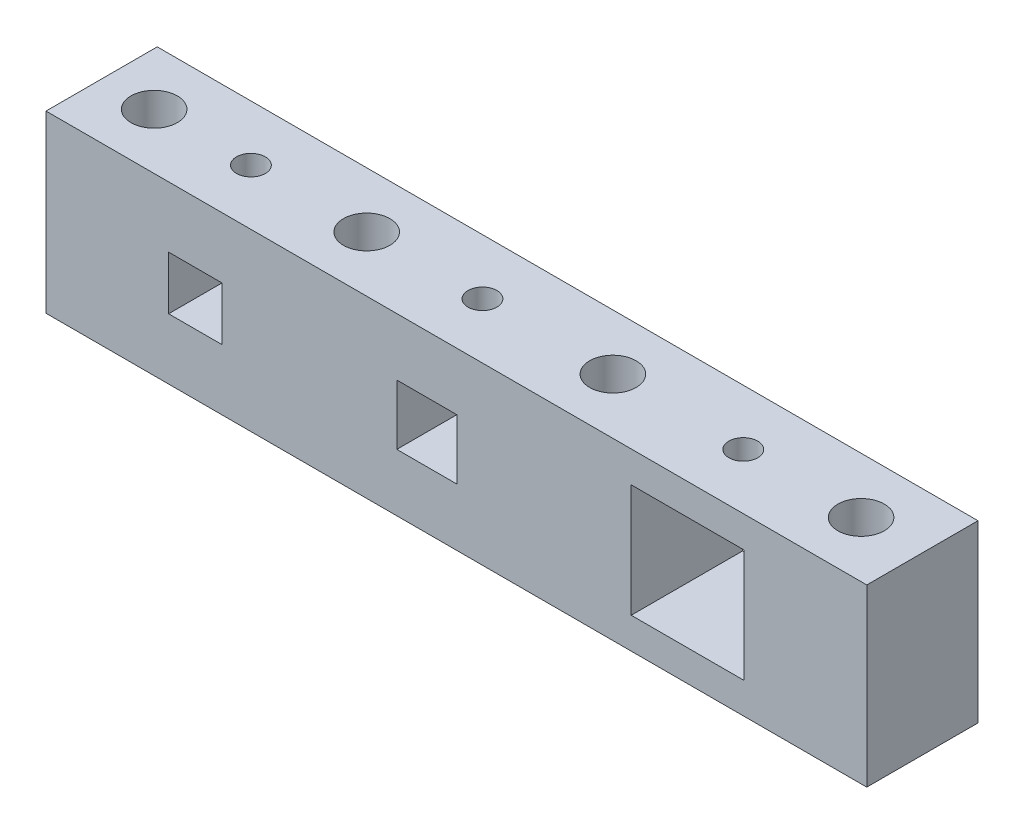
ISO-10303-21;
HEADER;
FILE_DESCRIPTION(('STEP AP214'),'2;1');
FILE_NAME('part.step','',(''),(''),'','','');
FILE_SCHEMA(('AUTOMOTIVE_DESIGN { 1 0 10303 214 1 1 1 1 }'));
ENDSEC;
DATA;
#1=APPLICATION_CONTEXT('core data for automotive mechanical design processes');
#2=APPLICATION_PROTOCOL_DEFINITION('international standard','automotive_design',2000,#1);
#3=PRODUCT_CONTEXT('',#1,'mechanical');
#4=PRODUCT('Part','Part','',(#3));
#5=PRODUCT_RELATED_PRODUCT_CATEGORY('part','',(#4));
#6=PRODUCT_DEFINITION_FORMATION('','',#4);
#7=PRODUCT_DEFINITION_CONTEXT('part definition',#1,'design');
#8=PRODUCT_DEFINITION('design','',#6,#7);
#9=PRODUCT_DEFINITION_SHAPE('','',#8);
#10=(LENGTH_UNIT() NAMED_UNIT(*) SI_UNIT(.MILLI.,.METRE.));
#11=(NAMED_UNIT(*) PLANE_ANGLE_UNIT() SI_UNIT($,.RADIAN.));
#12=(NAMED_UNIT(*) SI_UNIT($,.STERADIAN.) SOLID_ANGLE_UNIT());
#13=UNCERTAINTY_MEASURE_WITH_UNIT(LENGTH_MEASURE(1.E-05),#10,'distance_accuracy_value','');
#14=(GEOMETRIC_REPRESENTATION_CONTEXT(3) GLOBAL_UNCERTAINTY_ASSIGNED_CONTEXT((#13)) GLOBAL_UNIT_ASSIGNED_CONTEXT((#10,
#11,#12)) REPRESENTATION_CONTEXT('',''));
#15=CARTESIAN_POINT('',(0.,0.,0.));
#16=DIRECTION('',(0.,0.,1.));
#17=DIRECTION('',(1.,0.,0.));
#18=AXIS2_PLACEMENT_3D('',#15,#16,#17);
#19=CARTESIAN_POINT('',(-43.489,10.,12.7));
#20=DIRECTION('',(0.,-1.,0.));
#21=DIRECTION('',(0.,0.,-1.));
#22=AXIS2_PLACEMENT_3D('',#19,#20,#21);
#23=PLANE('',#22);
#24=CARTESIAN_POINT('',(-37.489,10.,6.35));
#25=DIRECTION('',(0.,1.,0.));
#26=DIRECTION('',(0.,0.,1.));
#27=AXIS2_PLACEMENT_3D('',#24,#25,#26);
#28=CIRCLE('',#27,2.65);
#29=CARTESIAN_POINT('',(-37.489,10.,9.));
#30=VERTEX_POINT('',#29);
#31=EDGE_CURVE('E445',#30,#30,#28,.T.);
#32=ORIENTED_EDGE('',*,*,#31,.F.);
#33=EDGE_LOOP('',(#32));
#34=FACE_BOUND('',#33,.T.);
#35=CARTESIAN_POINT('',(14.8945,10.,6.35));
#36=DIRECTION('',(0.,1.,0.));
#37=DIRECTION('',(0.,0.,1.));
#38=AXIS2_PLACEMENT_3D('',#35,#36,#37);
#39=CIRCLE('',#38,2.65);
#40=CARTESIAN_POINT('',(14.8945,10.,9.));
#41=VERTEX_POINT('',#40);
#42=EDGE_CURVE('E459',#41,#41,#39,.T.);
#43=ORIENTED_EDGE('',*,*,#42,.F.);
#44=EDGE_LOOP('',(#43));
#45=FACE_BOUND('',#44,.T.);
#46=CARTESIAN_POINT('',(43.239,10.,6.35));
#47=DIRECTION('',(0.,1.,0.));
#48=DIRECTION('',(0.,0.,1.));
#49=AXIS2_PLACEMENT_3D('',#46,#47,#48);
#50=CIRCLE('',#49,2.65);
#51=CARTESIAN_POINT('',(43.239,10.,9.));
#52=VERTEX_POINT('',#51);
#53=EDGE_CURVE('E467',#52,#52,#50,.T.);
#54=ORIENTED_EDGE('',*,*,#53,.F.);
#55=EDGE_LOOP('',(#54));
#56=FACE_BOUND('',#55,.T.);
#57=CARTESIAN_POINT('',(-26.439,10.,6.35));
#58=DIRECTION('',(0.,1.,0.));
#59=DIRECTION('',(0.,0.,1.));
#60=AXIS2_PLACEMENT_3D('',#57,#58,#59);
#61=CIRCLE('',#60,1.65);
#62=CARTESIAN_POINT('',(-26.439,10.,8.));
#63=VERTEX_POINT('',#62);
#64=EDGE_CURVE('E475',#63,#63,#61,.T.);
#65=ORIENTED_EDGE('',*,*,#64,.F.);
#66=EDGE_LOOP('',(#65));
#67=FACE_BOUND('',#66,.T.);
#68=CARTESIAN_POINT('',(0.,10.,6.35));
#69=DIRECTION('',(0.,1.,0.));
#70=DIRECTION('',(0.,0.,1.));
#71=AXIS2_PLACEMENT_3D('',#68,#69,#70);
#72=CIRCLE('',#71,1.65);
#73=CARTESIAN_POINT('',(0.,10.,8.));
#74=VERTEX_POINT('',#73);
#75=EDGE_CURVE('E483',#74,#74,#72,.T.);
#76=ORIENTED_EDGE('',*,*,#75,.F.);
#77=EDGE_LOOP('',(#76));
#78=FACE_BOUND('',#77,.T.);
#79=CARTESIAN_POINT('',(29.789,10.,6.35));
#80=DIRECTION('',(0.,1.,0.));
#81=DIRECTION('',(0.,0.,1.));
#82=AXIS2_PLACEMENT_3D('',#79,#80,#81);
#83=CIRCLE('',#82,1.65);
#84=CARTESIAN_POINT('',(29.789,10.,8.));
#85=VERTEX_POINT('',#84);
#86=EDGE_CURVE('E491',#85,#85,#83,.T.);
#87=ORIENTED_EDGE('',*,*,#86,.F.);
#88=EDGE_LOOP('',(#87));
#89=FACE_BOUND('',#88,.T.);
#90=DIRECTION('',(-1.,0.,0.));
#91=VECTOR('',#90,1.);
#92=CARTESIAN_POINT('',(-43.489,10.,0.));
#93=LINE('',#92,#91);
#94=CARTESIAN_POINT('',(50.239,10.,0.));
#95=VERTEX_POINT('',#94);
#96=CARTESIAN_POINT('',(-43.489,10.,0.));
#97=VERTEX_POINT('',#96);
#98=EDGE_CURVE('E295',#95,#97,#93,.T.);
#99=ORIENTED_EDGE('',*,*,#98,.T.);
#100=DIRECTION('',(0.,0.,-1.));
#101=VECTOR('',#100,1.);
#102=CARTESIAN_POINT('',(-43.489,10.,12.7));
#103=LINE('',#102,#101);
#104=CARTESIAN_POINT('',(-43.489,10.,12.7));
#105=VERTEX_POINT('',#104);
#106=EDGE_CURVE('E304',#105,#97,#103,.T.);
#107=ORIENTED_EDGE('',*,*,#106,.F.);
#108=DIRECTION('',(-1.,0.,0.));
#109=VECTOR('',#108,1.);
#110=CARTESIAN_POINT('',(-43.489,10.,12.7));
#111=LINE('',#110,#109);
#112=CARTESIAN_POINT('',(50.239,10.,12.7));
#113=VERTEX_POINT('',#112);
#114=EDGE_CURVE('E301',#113,#105,#111,.T.);
#115=ORIENTED_EDGE('',*,*,#114,.F.);
#116=DIRECTION('',(0.,0.,-1.));
#117=VECTOR('',#116,1.);
#118=CARTESIAN_POINT('',(50.239,10.,12.7));
#119=LINE('',#118,#117);
#120=EDGE_CURVE('E319',#113,#95,#119,.T.);
#121=ORIENTED_EDGE('',*,*,#120,.T.);
#122=EDGE_LOOP('',(#99,#107,#115,#121));
#123=FACE_BOUND('',#122,.T.);
#124=CARTESIAN_POINT('',(-13.2195,10.,6.35));
#125=DIRECTION('',(0.,1.,0.));
#126=DIRECTION('',(0.,0.,1.));
#127=AXIS2_PLACEMENT_3D('',#124,#125,#126);
#128=CIRCLE('',#127,2.65);
#129=CARTESIAN_POINT('',(-13.2195,10.,9.));
#130=VERTEX_POINT('',#129);
#131=EDGE_CURVE('E449',#130,#130,#128,.T.);
#132=ORIENTED_EDGE('',*,*,#131,.F.);
#133=EDGE_LOOP('',(#132));
#134=FACE_BOUND('',#133,.T.);
#135=ADVANCED_FACE('F39',(#34,#45,#56,#67,#78,#89,#123,#134),#23,.F.);
#136=CARTESIAN_POINT('',(0.,0.,12.7));
#137=DIRECTION('',(0.,0.,1.));
#138=DIRECTION('',(1.,0.,0.));
#139=AXIS2_PLACEMENT_3D('',#136,#137,#138);
#140=PLANE('',#139);
#141=DIRECTION('',(0.,-1.,0.));
#142=VECTOR('',#141,1.);
#143=CARTESIAN_POINT('',(-43.489,10.,12.7));
#144=LINE('',#143,#142);
#145=CARTESIAN_POINT('',(-43.489,-10.,12.7));
#146=VERTEX_POINT('',#145);
#147=EDGE_CURVE('E290',#105,#146,#144,.T.);
#148=ORIENTED_EDGE('',*,*,#147,.T.);
#149=DIRECTION('',(1.,0.,0.));
#150=VECTOR('',#149,1.);
#151=CARTESIAN_POINT('',(-43.489,-10.,12.7));
#152=LINE('',#151,#150);
#153=CARTESIAN_POINT('',(50.239,-10.,12.7));
#154=VERTEX_POINT('',#153);
#155=EDGE_CURVE('E294',#146,#154,#152,.T.);
#156=ORIENTED_EDGE('',*,*,#155,.T.);
#157=DIRECTION('',(0.,1.,0.));
#158=VECTOR('',#157,1.);
#159=CARTESIAN_POINT('',(50.239,10.,12.7));
#160=LINE('',#159,#158);
#161=EDGE_CURVE('E298',#154,#113,#160,.T.);
#162=ORIENTED_EDGE('',*,*,#161,.T.);
#163=ORIENTED_EDGE('',*,*,#114,.T.);
#164=EDGE_LOOP('',(#148,#156,#162,#163));
#165=FACE_BOUND('',#164,.T.);
#166=DIRECTION('',(-1.,0.,0.));
#167=VECTOR('',#166,1.);
#168=CARTESIAN_POINT('',(-29.489,3.05,12.7));
#169=LINE('',#168,#167);
#170=CARTESIAN_POINT('',(-23.389,3.05,12.7));
#171=VERTEX_POINT('',#170);
#172=CARTESIAN_POINT('',(-29.489,3.05,12.7));
#173=VERTEX_POINT('',#172);
#174=EDGE_CURVE('E250',#171,#173,#169,.T.);
#175=ORIENTED_EDGE('',*,*,#174,.F.);
#176=DIRECTION('',(0.,1.,0.));
#177=VECTOR('',#176,1.);
#178=CARTESIAN_POINT('',(-23.389,-3.05,12.7));
#179=LINE('',#178,#177);
#180=CARTESIAN_POINT('',(-23.389,-3.05,12.7));
#181=VERTEX_POINT('',#180);
#182=EDGE_CURVE('E247',#181,#171,#179,.T.);
#183=ORIENTED_EDGE('',*,*,#182,.F.);
#184=DIRECTION('',(1.,0.,0.));
#185=VECTOR('',#184,1.);
#186=CARTESIAN_POINT('',(-29.489,-3.05,12.7));
#187=LINE('',#186,#185);
#188=CARTESIAN_POINT('',(-29.489,-3.05,12.7));
#189=VERTEX_POINT('',#188);
#190=EDGE_CURVE('E258',#189,#181,#187,.T.);
#191=ORIENTED_EDGE('',*,*,#190,.F.);
#192=DIRECTION('',(0.,-1.,0.));
#193=VECTOR('',#192,1.);
#194=CARTESIAN_POINT('',(-29.489,-3.05,12.7));
#195=LINE('',#194,#193);
#196=EDGE_CURVE('E254',#173,#189,#195,.T.);
#197=ORIENTED_EDGE('',*,*,#196,.F.);
#198=EDGE_LOOP('',(#175,#183,#191,#197));
#199=FACE_BOUND('',#198,.T.);
#200=DIRECTION('',(-1.,0.,0.));
#201=VECTOR('',#200,1.);
#202=CARTESIAN_POINT('',(-3.429,3.429,12.7));
#203=LINE('',#202,#201);
#204=CARTESIAN_POINT('',(3.429,3.429,12.7));
#205=VERTEX_POINT('',#204);
#206=CARTESIAN_POINT('',(-3.429,3.429,12.7));
#207=VERTEX_POINT('',#206);
#208=EDGE_CURVE('E207',#205,#207,#203,.T.);
#209=ORIENTED_EDGE('',*,*,#208,.F.);
#210=DIRECTION('',(0.,1.,0.));
#211=VECTOR('',#210,1.);
#212=CARTESIAN_POINT('',(3.429,-3.429,12.7));
#213=LINE('',#212,#211);
#214=CARTESIAN_POINT('',(3.429,-3.429,12.7));
#215=VERTEX_POINT('',#214);
#216=EDGE_CURVE('E204',#215,#205,#213,.T.);
#217=ORIENTED_EDGE('',*,*,#216,.F.);
#218=DIRECTION('',(1.,0.,0.));
#219=VECTOR('',#218,1.);
#220=CARTESIAN_POINT('',(-3.429,-3.429,12.7));
#221=LINE('',#220,#219);
#222=CARTESIAN_POINT('',(-3.429,-3.429,12.7));
#223=VERTEX_POINT('',#222);
#224=EDGE_CURVE('E215',#223,#215,#221,.T.);
#225=ORIENTED_EDGE('',*,*,#224,.F.);
#226=DIRECTION('',(0.,-1.,0.));
#227=VECTOR('',#226,1.);
#228=CARTESIAN_POINT('',(-3.429,-3.429,12.7));
#229=LINE('',#228,#227);
#230=EDGE_CURVE('E211',#207,#223,#229,.T.);
#231=ORIENTED_EDGE('',*,*,#230,.F.);
#232=EDGE_LOOP('',(#209,#217,#225,#231));
#233=FACE_BOUND('',#232,.T.);
#234=DIRECTION('',(-1.,0.,0.));
#235=VECTOR('',#234,1.);
#236=CARTESIAN_POINT('',(23.339,6.45,12.7));
#237=LINE('',#236,#235);
#238=CARTESIAN_POINT('',(36.239,6.45,12.7));
#239=VERTEX_POINT('',#238);
#240=CARTESIAN_POINT('',(23.339,6.45,12.7));
#241=VERTEX_POINT('',#240);
#242=EDGE_CURVE('E162',#239,#241,#237,.T.);
#243=ORIENTED_EDGE('',*,*,#242,.F.);
#244=DIRECTION('',(0.,1.,0.));
#245=VECTOR('',#244,1.);
#246=CARTESIAN_POINT('',(36.239,-6.45,12.7));
#247=LINE('',#246,#245);
#248=CARTESIAN_POINT('',(36.239,-6.45,12.7));
#249=VERTEX_POINT('',#248);
#250=EDGE_CURVE('E153',#249,#239,#247,.T.);
#251=ORIENTED_EDGE('',*,*,#250,.F.);
#252=DIRECTION('',(1.,0.,0.));
#253=VECTOR('',#252,1.);
#254=CARTESIAN_POINT('',(23.339,-6.45,12.7));
#255=LINE('',#254,#253);
#256=CARTESIAN_POINT('',(23.339,-6.45,12.7));
#257=VERTEX_POINT('',#256);
#258=EDGE_CURVE('E180',#257,#249,#255,.T.);
#259=ORIENTED_EDGE('',*,*,#258,.F.);
#260=DIRECTION('',(0.,-1.,0.));
#261=VECTOR('',#260,1.);
#262=CARTESIAN_POINT('',(23.339,-6.45,12.7));
#263=LINE('',#262,#261);
#264=EDGE_CURVE('E176',#241,#257,#263,.T.);
#265=ORIENTED_EDGE('',*,*,#264,.F.);
#266=EDGE_LOOP('',(#243,#251,#259,#265));
#267=FACE_BOUND('',#266,.T.);
#268=ADVANCED_FACE('F175',(#165,#199,#233,#267),#140,.T.);
#269=CARTESIAN_POINT('',(0.,0.,0.));
#270=DIRECTION('',(0.,0.,1.));
#271=DIRECTION('',(1.,0.,0.));
#272=AXIS2_PLACEMENT_3D('',#269,#270,#271);
#273=PLANE('',#272);
#274=DIRECTION('',(0.,1.,0.));
#275=VECTOR('',#274,1.);
#276=CARTESIAN_POINT('',(3.429,-3.429,0.));
#277=LINE('',#276,#275);
#278=CARTESIAN_POINT('',(3.429,-3.429,0.));
#279=VERTEX_POINT('',#278);
#280=CARTESIAN_POINT('',(3.429,3.429,0.));
#281=VERTEX_POINT('',#280);
#282=EDGE_CURVE('E171',#279,#281,#277,.T.);
#283=ORIENTED_EDGE('',*,*,#282,.T.);
#284=DIRECTION('',(-1.,0.,0.));
#285=VECTOR('',#284,1.);
#286=CARTESIAN_POINT('',(-3.429,3.429,0.));
#287=LINE('',#286,#285);
#288=CARTESIAN_POINT('',(-3.429,3.429,0.));
#289=VERTEX_POINT('',#288);
#290=EDGE_CURVE('E222',#281,#289,#287,.T.);
#291=ORIENTED_EDGE('',*,*,#290,.T.);
#292=DIRECTION('',(0.,-1.,0.));
#293=VECTOR('',#292,1.);
#294=CARTESIAN_POINT('',(-3.429,-3.429,0.));
#295=LINE('',#294,#293);
#296=CARTESIAN_POINT('',(-3.429,-3.429,0.));
#297=VERTEX_POINT('',#296);
#298=EDGE_CURVE('E226',#289,#297,#295,.T.);
#299=ORIENTED_EDGE('',*,*,#298,.T.);
#300=DIRECTION('',(1.,0.,0.));
#301=VECTOR('',#300,1.);
#302=CARTESIAN_POINT('',(-3.429,-3.429,0.));
#303=LINE('',#302,#301);
#304=EDGE_CURVE('E208',#297,#279,#303,.T.);
#305=ORIENTED_EDGE('',*,*,#304,.T.);
#306=EDGE_LOOP('',(#283,#291,#299,#305));
#307=FACE_BOUND('',#306,.T.);
#308=DIRECTION('',(0.,-1.,0.));
#309=VECTOR('',#308,1.);
#310=CARTESIAN_POINT('',(-43.489,10.,0.));
#311=LINE('',#310,#309);
#312=CARTESIAN_POINT('',(-43.489,-10.,0.));
#313=VERTEX_POINT('',#312);
#314=EDGE_CURVE('E289',#97,#313,#311,.T.);
#315=ORIENTED_EDGE('',*,*,#314,.F.);
#316=ORIENTED_EDGE('',*,*,#98,.F.);
#317=DIRECTION('',(0.,1.,0.));
#318=VECTOR('',#317,1.);
#319=CARTESIAN_POINT('',(50.239,10.,0.));
#320=LINE('',#319,#318);
#321=CARTESIAN_POINT('',(50.239,-10.,0.));
#322=VERTEX_POINT('',#321);
#323=EDGE_CURVE('E311',#322,#95,#320,.T.);
#324=ORIENTED_EDGE('',*,*,#323,.F.);
#325=DIRECTION('',(1.,0.,0.));
#326=VECTOR('',#325,1.);
#327=CARTESIAN_POINT('',(-43.489,-10.,0.));
#328=LINE('',#327,#326);
#329=EDGE_CURVE('E308',#313,#322,#328,.T.);
#330=ORIENTED_EDGE('',*,*,#329,.F.);
#331=EDGE_LOOP('',(#315,#316,#324,#330));
#332=FACE_BOUND('',#331,.T.);
#333=DIRECTION('',(0.,1.,0.));
#334=VECTOR('',#333,1.);
#335=CARTESIAN_POINT('',(-23.389,-3.05,0.));
#336=LINE('',#335,#334);
#337=CARTESIAN_POINT('',(-23.389,-3.05,0.));
#338=VERTEX_POINT('',#337);
#339=CARTESIAN_POINT('',(-23.389,3.05,0.));
#340=VERTEX_POINT('',#339);
#341=EDGE_CURVE('E246',#338,#340,#336,.T.);
#342=ORIENTED_EDGE('',*,*,#341,.T.);
#343=DIRECTION('',(-1.,0.,0.));
#344=VECTOR('',#343,1.);
#345=CARTESIAN_POINT('',(-29.489,3.05,0.));
#346=LINE('',#345,#344);
#347=CARTESIAN_POINT('',(-29.489,3.05,0.));
#348=VERTEX_POINT('',#347);
#349=EDGE_CURVE('E265',#340,#348,#346,.T.);
#350=ORIENTED_EDGE('',*,*,#349,.T.);
#351=DIRECTION('',(0.,-1.,0.));
#352=VECTOR('',#351,1.);
#353=CARTESIAN_POINT('',(-29.489,-3.05,0.));
#354=LINE('',#353,#352);
#355=CARTESIAN_POINT('',(-29.489,-3.05,0.));
#356=VERTEX_POINT('',#355);
#357=EDGE_CURVE('E269',#348,#356,#354,.T.);
#358=ORIENTED_EDGE('',*,*,#357,.T.);
#359=DIRECTION('',(1.,0.,0.));
#360=VECTOR('',#359,1.);
#361=CARTESIAN_POINT('',(-29.489,-3.05,0.));
#362=LINE('',#361,#360);
#363=EDGE_CURVE('E251',#356,#338,#362,.T.);
#364=ORIENTED_EDGE('',*,*,#363,.T.);
#365=EDGE_LOOP('',(#342,#350,#358,#364));
#366=FACE_BOUND('',#365,.T.);
#367=DIRECTION('',(0.,1.,0.));
#368=VECTOR('',#367,1.);
#369=CARTESIAN_POINT('',(36.239,-6.45,0.));
#370=LINE('',#369,#368);
#371=CARTESIAN_POINT('',(36.239,-6.45,0.));
#372=VERTEX_POINT('',#371);
#373=CARTESIAN_POINT('',(36.239,6.45,0.));
#374=VERTEX_POINT('',#373);
#375=EDGE_CURVE('E63',#372,#374,#370,.T.);
#376=ORIENTED_EDGE('',*,*,#375,.T.);
#377=DIRECTION('',(-1.,0.,0.));
#378=VECTOR('',#377,1.);
#379=CARTESIAN_POINT('',(23.339,6.45,0.));
#380=LINE('',#379,#378);
#381=CARTESIAN_POINT('',(23.339,6.45,0.));
#382=VERTEX_POINT('',#381);
#383=EDGE_CURVE('E169',#374,#382,#380,.T.);
#384=ORIENTED_EDGE('',*,*,#383,.T.);
#385=DIRECTION('',(0.,-1.,0.));
#386=VECTOR('',#385,1.);
#387=CARTESIAN_POINT('',(23.339,-6.45,0.));
#388=LINE('',#387,#386);
#389=CARTESIAN_POINT('',(23.339,-6.45,0.));
#390=VERTEX_POINT('',#389);
#391=EDGE_CURVE('E191',#382,#390,#388,.T.);
#392=ORIENTED_EDGE('',*,*,#391,.T.);
#393=DIRECTION('',(1.,0.,0.));
#394=VECTOR('',#393,1.);
#395=CARTESIAN_POINT('',(23.339,-6.45,0.));
#396=LINE('',#395,#394);
#397=EDGE_CURVE('E163',#390,#372,#396,.T.);
#398=ORIENTED_EDGE('',*,*,#397,.T.);
#399=EDGE_LOOP('',(#376,#384,#392,#398));
#400=FACE_BOUND('',#399,.T.);
#401=ADVANCED_FACE('F334',(#307,#332,#366,#400),#273,.F.);
#402=CARTESIAN_POINT('',(-43.489,10.,12.7));
#403=DIRECTION('',(1.,0.,0.));
#404=DIRECTION('',(0.,0.,-1.));
#405=AXIS2_PLACEMENT_3D('',#402,#403,#404);
#406=PLANE('',#405);
#407=ORIENTED_EDGE('',*,*,#314,.T.);
#408=DIRECTION('',(0.,0.,-1.));
#409=VECTOR('',#408,1.);
#410=CARTESIAN_POINT('',(-43.489,-10.,12.7));
#411=LINE('',#410,#409);
#412=EDGE_CURVE('E11',#146,#313,#411,.T.);
#413=ORIENTED_EDGE('',*,*,#412,.F.);
#414=ORIENTED_EDGE('',*,*,#147,.F.);
#415=ORIENTED_EDGE('',*,*,#106,.T.);
#416=EDGE_LOOP('',(#407,#413,#414,#415));
#417=FACE_BOUND('',#416,.T.);
#418=ADVANCED_FACE('F41',(#417),#406,.F.);
#419=CARTESIAN_POINT('',(-43.489,-10.,12.7));
#420=DIRECTION('',(0.,1.,0.));
#421=DIRECTION('',(0.,0.,1.));
#422=AXIS2_PLACEMENT_3D('',#419,#420,#421);
#423=PLANE('',#422);
#424=CARTESIAN_POINT('',(-37.489,-10.,6.35));
#425=DIRECTION('',(0.,1.,0.));
#426=DIRECTION('',(0.,0.,1.));
#427=AXIS2_PLACEMENT_3D('',#424,#425,#426);
#428=CIRCLE('',#427,2.65);
#429=CARTESIAN_POINT('',(-37.489,-10.,9.));
#430=VERTEX_POINT('',#429);
#431=EDGE_CURVE('E443',#430,#430,#428,.T.);
#432=ORIENTED_EDGE('',*,*,#431,.T.);
#433=EDGE_LOOP('',(#432));
#434=FACE_BOUND('',#433,.T.);
#435=CARTESIAN_POINT('',(-13.2195,-10.,6.35));
#436=DIRECTION('',(0.,1.,0.));
#437=DIRECTION('',(0.,0.,1.));
#438=AXIS2_PLACEMENT_3D('',#435,#436,#437);
#439=CIRCLE('',#438,2.65);
#440=CARTESIAN_POINT('',(-13.2195,-10.,9.));
#441=VERTEX_POINT('',#440);
#442=EDGE_CURVE('E455',#441,#441,#439,.T.);
#443=ORIENTED_EDGE('',*,*,#442,.T.);
#444=EDGE_LOOP('',(#443));
#445=FACE_BOUND('',#444,.T.);
#446=CARTESIAN_POINT('',(14.8945,-10.,6.35));
#447=DIRECTION('',(0.,1.,0.));
#448=DIRECTION('',(0.,0.,1.));
#449=AXIS2_PLACEMENT_3D('',#446,#447,#448);
#450=CIRCLE('',#449,2.65);
#451=CARTESIAN_POINT('',(14.8945,-10.,9.));
#452=VERTEX_POINT('',#451);
#453=EDGE_CURVE('E463',#452,#452,#450,.T.);
#454=ORIENTED_EDGE('',*,*,#453,.T.);
#455=EDGE_LOOP('',(#454));
#456=FACE_BOUND('',#455,.T.);
#457=CARTESIAN_POINT('',(43.239,-10.,6.35));
#458=DIRECTION('',(0.,1.,0.));
#459=DIRECTION('',(0.,0.,1.));
#460=AXIS2_PLACEMENT_3D('',#457,#458,#459);
#461=CIRCLE('',#460,2.65);
#462=CARTESIAN_POINT('',(43.239,-10.,9.));
#463=VERTEX_POINT('',#462);
#464=EDGE_CURVE('E471',#463,#463,#461,.T.);
#465=ORIENTED_EDGE('',*,*,#464,.T.);
#466=EDGE_LOOP('',(#465));
#467=FACE_BOUND('',#466,.T.);
#468=ORIENTED_EDGE('',*,*,#329,.T.);
#469=DIRECTION('',(0.,0.,-1.));
#470=VECTOR('',#469,1.);
#471=CARTESIAN_POINT('',(50.239,-10.,12.7));
#472=LINE('',#471,#470);
#473=EDGE_CURVE('E48',#154,#322,#472,.T.);
#474=ORIENTED_EDGE('',*,*,#473,.F.);
#475=ORIENTED_EDGE('',*,*,#155,.F.);
#476=ORIENTED_EDGE('',*,*,#412,.T.);
#477=EDGE_LOOP('',(#468,#474,#475,#476));
#478=FACE_BOUND('',#477,.T.);
#479=ADVANCED_FACE('F345',(#434,#445,#456,#467,#478),#423,.F.);
#480=CARTESIAN_POINT('',(50.239,10.,12.7));
#481=DIRECTION('',(-1.,0.,0.));
#482=DIRECTION('',(0.,0.,1.));
#483=AXIS2_PLACEMENT_3D('',#480,#481,#482);
#484=PLANE('',#483);
#485=ORIENTED_EDGE('',*,*,#323,.T.);
#486=ORIENTED_EDGE('',*,*,#120,.F.);
#487=ORIENTED_EDGE('',*,*,#161,.F.);
#488=ORIENTED_EDGE('',*,*,#473,.T.);
#489=EDGE_LOOP('',(#485,#486,#487,#488));
#490=FACE_BOUND('',#489,.T.);
#491=ADVANCED_FACE('F328',(#490),#484,.F.);
#492=CARTESIAN_POINT('',(-23.389,-3.05,12.7));
#493=DIRECTION('',(-1.,0.,0.));
#494=DIRECTION('',(0.,0.,1.));
#495=AXIS2_PLACEMENT_3D('',#492,#493,#494);
#496=PLANE('',#495);
#497=ORIENTED_EDGE('',*,*,#341,.F.);
#498=DIRECTION('',(0.,0.,-1.));
#499=VECTOR('',#498,1.);
#500=CARTESIAN_POINT('',(-23.389,-3.05,12.7));
#501=LINE('',#500,#499);
#502=EDGE_CURVE('E261',#181,#338,#501,.T.);
#503=ORIENTED_EDGE('',*,*,#502,.F.);
#504=ORIENTED_EDGE('',*,*,#182,.T.);
#505=DIRECTION('',(0.,0.,-1.));
#506=VECTOR('',#505,1.);
#507=CARTESIAN_POINT('',(-23.389,3.05,12.7));
#508=LINE('',#507,#506);
#509=EDGE_CURVE('E285',#171,#340,#508,.T.);
#510=ORIENTED_EDGE('',*,*,#509,.T.);
#511=EDGE_LOOP('',(#497,#503,#504,#510));
#512=FACE_BOUND('',#511,.T.);
#513=ADVANCED_FACE('F352',(#512),#496,.T.);
#514=CARTESIAN_POINT('',(-29.489,3.05,12.7));
#515=DIRECTION('',(0.,-1.,0.));
#516=DIRECTION('',(0.,0.,-1.));
#517=AXIS2_PLACEMENT_3D('',#514,#515,#516);
#518=PLANE('',#517);
#519=CARTESIAN_POINT('',(-26.439,3.05,6.35));
#520=DIRECTION('',(0.,-1.,0.));
#521=DIRECTION('',(0.,0.,-1.));
#522=AXIS2_PLACEMENT_3D('',#519,#520,#521);
#523=CIRCLE('',#522,1.65);
#524=CARTESIAN_POINT('',(-26.439,3.05,4.7));
#525=VERTEX_POINT('',#524);
#526=EDGE_CURVE('E479',#525,#525,#523,.T.);
#527=ORIENTED_EDGE('',*,*,#526,.F.);
#528=EDGE_LOOP('',(#527));
#529=FACE_BOUND('',#528,.T.);
#530=ORIENTED_EDGE('',*,*,#349,.F.);
#531=ORIENTED_EDGE('',*,*,#509,.F.);
#532=ORIENTED_EDGE('',*,*,#174,.T.);
#533=DIRECTION('',(0.,0.,-1.));
#534=VECTOR('',#533,1.);
#535=CARTESIAN_POINT('',(-29.489,3.05,12.7));
#536=LINE('',#535,#534);
#537=EDGE_CURVE('E282',#173,#348,#536,.T.);
#538=ORIENTED_EDGE('',*,*,#537,.T.);
#539=EDGE_LOOP('',(#530,#531,#532,#538));
#540=FACE_BOUND('',#539,.T.);
#541=ADVANCED_FACE('F371',(#529,#540),#518,.T.);
#542=CARTESIAN_POINT('',(-29.489,-3.05,12.7));
#543=DIRECTION('',(1.,0.,0.));
#544=DIRECTION('',(0.,0.,-1.));
#545=AXIS2_PLACEMENT_3D('',#542,#543,#544);
#546=PLANE('',#545);
#547=ORIENTED_EDGE('',*,*,#357,.F.);
#548=ORIENTED_EDGE('',*,*,#537,.F.);
#549=ORIENTED_EDGE('',*,*,#196,.T.);
#550=DIRECTION('',(0.,0.,-1.));
#551=VECTOR('',#550,1.);
#552=CARTESIAN_POINT('',(-29.489,-3.05,12.7));
#553=LINE('',#552,#551);
#554=EDGE_CURVE('E279',#189,#356,#553,.T.);
#555=ORIENTED_EDGE('',*,*,#554,.T.);
#556=EDGE_LOOP('',(#547,#548,#549,#555));
#557=FACE_BOUND('',#556,.T.);
#558=ADVANCED_FACE('F375',(#557),#546,.T.);
#559=CARTESIAN_POINT('',(-29.489,-3.05,12.7));
#560=DIRECTION('',(0.,1.,0.));
#561=DIRECTION('',(0.,0.,1.));
#562=AXIS2_PLACEMENT_3D('',#559,#560,#561);
#563=PLANE('',#562);
#564=ORIENTED_EDGE('',*,*,#363,.F.);
#565=ORIENTED_EDGE('',*,*,#554,.F.);
#566=ORIENTED_EDGE('',*,*,#190,.T.);
#567=ORIENTED_EDGE('',*,*,#502,.T.);
#568=EDGE_LOOP('',(#564,#565,#566,#567));
#569=FACE_BOUND('',#568,.T.);
#570=ADVANCED_FACE('F379',(#569),#563,.T.);
#571=CARTESIAN_POINT('',(3.429,-3.429,12.7));
#572=DIRECTION('',(-1.,0.,0.));
#573=DIRECTION('',(0.,0.,1.));
#574=AXIS2_PLACEMENT_3D('',#571,#572,#573);
#575=PLANE('',#574);
#576=ORIENTED_EDGE('',*,*,#282,.F.);
#577=DIRECTION('',(0.,0.,-1.));
#578=VECTOR('',#577,1.);
#579=CARTESIAN_POINT('',(3.429,-3.429,12.7));
#580=LINE('',#579,#578);
#581=EDGE_CURVE('E218',#215,#279,#580,.T.);
#582=ORIENTED_EDGE('',*,*,#581,.F.);
#583=ORIENTED_EDGE('',*,*,#216,.T.);
#584=DIRECTION('',(0.,0.,-1.));
#585=VECTOR('',#584,1.);
#586=CARTESIAN_POINT('',(3.429,3.429,12.7));
#587=LINE('',#586,#585);
#588=EDGE_CURVE('E242',#205,#281,#587,.T.);
#589=ORIENTED_EDGE('',*,*,#588,.T.);
#590=EDGE_LOOP('',(#576,#582,#583,#589));
#591=FACE_BOUND('',#590,.T.);
#592=ADVANCED_FACE('F383',(#591),#575,.T.);
#593=CARTESIAN_POINT('',(-3.429,3.429,12.7));
#594=DIRECTION('',(0.,-1.,0.));
#595=DIRECTION('',(0.,0.,-1.));
#596=AXIS2_PLACEMENT_3D('',#593,#594,#595);
#597=PLANE('',#596);
#598=CARTESIAN_POINT('',(0.,3.429,6.35));
#599=DIRECTION('',(0.,-1.,0.));
#600=DIRECTION('',(0.,0.,-1.));
#601=AXIS2_PLACEMENT_3D('',#598,#599,#600);
#602=CIRCLE('',#601,1.65);
#603=CARTESIAN_POINT('',(0.,3.429,4.7));
#604=VERTEX_POINT('',#603);
#605=EDGE_CURVE('E487',#604,#604,#602,.T.);
#606=ORIENTED_EDGE('',*,*,#605,.F.);
#607=EDGE_LOOP('',(#606));
#608=FACE_BOUND('',#607,.T.);
#609=ORIENTED_EDGE('',*,*,#290,.F.);
#610=ORIENTED_EDGE('',*,*,#588,.F.);
#611=ORIENTED_EDGE('',*,*,#208,.T.);
#612=DIRECTION('',(0.,0.,-1.));
#613=VECTOR('',#612,1.);
#614=CARTESIAN_POINT('',(-3.429,3.429,12.7));
#615=LINE('',#614,#613);
#616=EDGE_CURVE('E239',#207,#289,#615,.T.);
#617=ORIENTED_EDGE('',*,*,#616,.T.);
#618=EDGE_LOOP('',(#609,#610,#611,#617));
#619=FACE_BOUND('',#618,.T.);
#620=ADVANCED_FACE('F387',(#608,#619),#597,.T.);
#621=CARTESIAN_POINT('',(-3.429,-3.429,12.7));
#622=DIRECTION('',(1.,0.,0.));
#623=DIRECTION('',(0.,0.,-1.));
#624=AXIS2_PLACEMENT_3D('',#621,#622,#623);
#625=PLANE('',#624);
#626=ORIENTED_EDGE('',*,*,#298,.F.);
#627=ORIENTED_EDGE('',*,*,#616,.F.);
#628=ORIENTED_EDGE('',*,*,#230,.T.);
#629=DIRECTION('',(0.,0.,-1.));
#630=VECTOR('',#629,1.);
#631=CARTESIAN_POINT('',(-3.429,-3.429,12.7));
#632=LINE('',#631,#630);
#633=EDGE_CURVE('E236',#223,#297,#632,.T.);
#634=ORIENTED_EDGE('',*,*,#633,.T.);
#635=EDGE_LOOP('',(#626,#627,#628,#634));
#636=FACE_BOUND('',#635,.T.);
#637=ADVANCED_FACE('F391',(#636),#625,.T.);
#638=CARTESIAN_POINT('',(-3.429,-3.429,12.7));
#639=DIRECTION('',(0.,1.,0.));
#640=DIRECTION('',(0.,0.,1.));
#641=AXIS2_PLACEMENT_3D('',#638,#639,#640);
#642=PLANE('',#641);
#643=ORIENTED_EDGE('',*,*,#304,.F.);
#644=ORIENTED_EDGE('',*,*,#633,.F.);
#645=ORIENTED_EDGE('',*,*,#224,.T.);
#646=ORIENTED_EDGE('',*,*,#581,.T.);
#647=EDGE_LOOP('',(#643,#644,#645,#646));
#648=FACE_BOUND('',#647,.T.);
#649=ADVANCED_FACE('F395',(#648),#642,.T.);
#650=CARTESIAN_POINT('',(36.239,-6.45,12.7));
#651=DIRECTION('',(-1.,0.,0.));
#652=DIRECTION('',(0.,0.,1.));
#653=AXIS2_PLACEMENT_3D('',#650,#651,#652);
#654=PLANE('',#653);
#655=ORIENTED_EDGE('',*,*,#375,.F.);
#656=DIRECTION('',(0.,0.,-1.));
#657=VECTOR('',#656,1.);
#658=CARTESIAN_POINT('',(36.239,-6.45,12.7));
#659=LINE('',#658,#657);
#660=EDGE_CURVE('E157',#249,#372,#659,.T.);
#661=ORIENTED_EDGE('',*,*,#660,.F.);
#662=ORIENTED_EDGE('',*,*,#250,.T.);
#663=DIRECTION('',(0.,0.,-1.));
#664=VECTOR('',#663,1.);
#665=CARTESIAN_POINT('',(36.239,6.45,12.7));
#666=LINE('',#665,#664);
#667=EDGE_CURVE('E156',#239,#374,#666,.T.);
#668=ORIENTED_EDGE('',*,*,#667,.T.);
#669=EDGE_LOOP('',(#655,#661,#662,#668));
#670=FACE_BOUND('',#669,.T.);
#671=ADVANCED_FACE('F155',(#670),#654,.T.);
#672=CARTESIAN_POINT('',(23.339,6.45,12.7));
#673=DIRECTION('',(0.,-1.,0.));
#674=DIRECTION('',(0.,0.,-1.));
#675=AXIS2_PLACEMENT_3D('',#672,#673,#674);
#676=PLANE('',#675);
#677=CARTESIAN_POINT('',(29.789,6.45,6.35));
#678=DIRECTION('',(0.,-1.,0.));
#679=DIRECTION('',(0.,0.,-1.));
#680=AXIS2_PLACEMENT_3D('',#677,#678,#679);
#681=CIRCLE('',#680,1.65);
#682=CARTESIAN_POINT('',(29.789,6.45,4.7));
#683=VERTEX_POINT('',#682);
#684=EDGE_CURVE('E188',#683,#683,#681,.T.);
#685=ORIENTED_EDGE('',*,*,#684,.F.);
#686=EDGE_LOOP('',(#685));
#687=FACE_BOUND('',#686,.T.);
#688=ORIENTED_EDGE('',*,*,#383,.F.);
#689=ORIENTED_EDGE('',*,*,#667,.F.);
#690=ORIENTED_EDGE('',*,*,#242,.T.);
#691=DIRECTION('',(0.,0.,-1.));
#692=VECTOR('',#691,1.);
#693=CARTESIAN_POINT('',(23.339,6.45,12.7));
#694=LINE('',#693,#692);
#695=EDGE_CURVE('E172',#241,#382,#694,.T.);
#696=ORIENTED_EDGE('',*,*,#695,.T.);
#697=EDGE_LOOP('',(#688,#689,#690,#696));
#698=FACE_BOUND('',#697,.T.);
#699=ADVANCED_FACE('F166',(#687,#698),#676,.T.);
#700=CARTESIAN_POINT('',(23.339,-6.45,12.7));
#701=DIRECTION('',(1.,0.,0.));
#702=DIRECTION('',(0.,0.,-1.));
#703=AXIS2_PLACEMENT_3D('',#700,#701,#702);
#704=PLANE('',#703);
#705=ORIENTED_EDGE('',*,*,#391,.F.);
#706=ORIENTED_EDGE('',*,*,#695,.F.);
#707=ORIENTED_EDGE('',*,*,#264,.T.);
#708=DIRECTION('',(0.,0.,-1.));
#709=VECTOR('',#708,1.);
#710=CARTESIAN_POINT('',(23.339,-6.45,12.7));
#711=LINE('',#710,#709);
#712=EDGE_CURVE('E55',#257,#390,#711,.T.);
#713=ORIENTED_EDGE('',*,*,#712,.T.);
#714=EDGE_LOOP('',(#705,#706,#707,#713));
#715=FACE_BOUND('',#714,.T.);
#716=ADVANCED_FACE('F404',(#715),#704,.T.);
#717=CARTESIAN_POINT('',(23.339,-6.45,12.7));
#718=DIRECTION('',(0.,1.,0.));
#719=DIRECTION('',(0.,0.,1.));
#720=AXIS2_PLACEMENT_3D('',#717,#718,#719);
#721=PLANE('',#720);
#722=ORIENTED_EDGE('',*,*,#397,.F.);
#723=ORIENTED_EDGE('',*,*,#712,.F.);
#724=ORIENTED_EDGE('',*,*,#258,.T.);
#725=ORIENTED_EDGE('',*,*,#660,.T.);
#726=EDGE_LOOP('',(#722,#723,#724,#725));
#727=FACE_BOUND('',#726,.T.);
#728=ADVANCED_FACE('F408',(#727),#721,.T.);
#729=CARTESIAN_POINT('',(29.789,10.,6.35));
#730=DIRECTION('',(0.,1.,0.));
#731=DIRECTION('',(0.,0.,1.));
#732=AXIS2_PLACEMENT_3D('',#729,#730,#731);
#733=CYLINDRICAL_SURFACE('',#732,1.65);
#734=ORIENTED_EDGE('',*,*,#86,.T.);
#735=EDGE_LOOP('',(#734));
#736=FACE_BOUND('',#735,.T.);
#737=ORIENTED_EDGE('',*,*,#684,.T.);
#738=EDGE_LOOP('',(#737));
#739=FACE_BOUND('',#738,.T.);
#740=ADVANCED_FACE('F412',(#736,#739),#733,.F.);
#741=CARTESIAN_POINT('',(0.,10.,6.35));
#742=DIRECTION('',(0.,1.,0.));
#743=DIRECTION('',(0.,0.,1.));
#744=AXIS2_PLACEMENT_3D('',#741,#742,#743);
#745=CYLINDRICAL_SURFACE('',#744,1.65);
#746=ORIENTED_EDGE('',*,*,#75,.T.);
#747=EDGE_LOOP('',(#746));
#748=FACE_BOUND('',#747,.T.);
#749=ORIENTED_EDGE('',*,*,#605,.T.);
#750=EDGE_LOOP('',(#749));
#751=FACE_BOUND('',#750,.T.);
#752=ADVANCED_FACE('F415',(#748,#751),#745,.F.);
#753=CARTESIAN_POINT('',(-26.439,10.,6.35));
#754=DIRECTION('',(0.,1.,0.));
#755=DIRECTION('',(0.,0.,1.));
#756=AXIS2_PLACEMENT_3D('',#753,#754,#755);
#757=CYLINDRICAL_SURFACE('',#756,1.65);
#758=ORIENTED_EDGE('',*,*,#64,.T.);
#759=EDGE_LOOP('',(#758));
#760=FACE_BOUND('',#759,.T.);
#761=ORIENTED_EDGE('',*,*,#526,.T.);
#762=EDGE_LOOP('',(#761));
#763=FACE_BOUND('',#762,.T.);
#764=ADVANCED_FACE('F419',(#760,#763),#757,.F.);
#765=CARTESIAN_POINT('',(43.239,10.,6.35));
#766=DIRECTION('',(0.,1.,0.));
#767=DIRECTION('',(0.,0.,1.));
#768=AXIS2_PLACEMENT_3D('',#765,#766,#767);
#769=CYLINDRICAL_SURFACE('',#768,2.65);
#770=ORIENTED_EDGE('',*,*,#464,.F.);
#771=EDGE_LOOP('',(#770));
#772=FACE_BOUND('',#771,.T.);
#773=ORIENTED_EDGE('',*,*,#53,.T.);
#774=EDGE_LOOP('',(#773));
#775=FACE_BOUND('',#774,.T.);
#776=ADVANCED_FACE('F423',(#772,#775),#769,.F.);
#777=CARTESIAN_POINT('',(14.8945,10.,6.35));
#778=DIRECTION('',(0.,1.,0.));
#779=DIRECTION('',(0.,0.,1.));
#780=AXIS2_PLACEMENT_3D('',#777,#778,#779);
#781=CYLINDRICAL_SURFACE('',#780,2.65);
#782=ORIENTED_EDGE('',*,*,#453,.F.);
#783=EDGE_LOOP('',(#782));
#784=FACE_BOUND('',#783,.T.);
#785=ORIENTED_EDGE('',*,*,#42,.T.);
#786=EDGE_LOOP('',(#785));
#787=FACE_BOUND('',#786,.T.);
#788=ADVANCED_FACE('F427',(#784,#787),#781,.F.);
#789=CARTESIAN_POINT('',(-13.2195,10.,6.35));
#790=DIRECTION('',(0.,1.,0.));
#791=DIRECTION('',(0.,0.,1.));
#792=AXIS2_PLACEMENT_3D('',#789,#790,#791);
#793=CYLINDRICAL_SURFACE('',#792,2.65);
#794=ORIENTED_EDGE('',*,*,#442,.F.);
#795=EDGE_LOOP('',(#794));
#796=FACE_BOUND('',#795,.T.);
#797=ORIENTED_EDGE('',*,*,#131,.T.);
#798=EDGE_LOOP('',(#797));
#799=FACE_BOUND('',#798,.T.);
#800=ADVANCED_FACE('F431',(#796,#799),#793,.F.);
#801=CARTESIAN_POINT('',(-37.489,10.,6.35));
#802=DIRECTION('',(0.,1.,0.));
#803=DIRECTION('',(0.,0.,1.));
#804=AXIS2_PLACEMENT_3D('',#801,#802,#803);
#805=CYLINDRICAL_SURFACE('',#804,2.65);
#806=ORIENTED_EDGE('',*,*,#431,.F.);
#807=EDGE_LOOP('',(#806));
#808=FACE_BOUND('',#807,.T.);
#809=ORIENTED_EDGE('',*,*,#31,.T.);
#810=EDGE_LOOP('',(#809));
#811=FACE_BOUND('',#810,.T.);
#812=ADVANCED_FACE('F435',(#808,#811),#805,.F.);
#813=CLOSED_SHELL('',(#135,#268,#401,#418,#479,#491,#513,#541,#558,#570,#592,#620,#637,#649,
#671,#699,#716,#728,#740,#752,#764,#776,#788,#800,#812));
#814=MANIFOLD_SOLID_BREP('B2',#813);
#815=ADVANCED_BREP_SHAPE_REPRESENTATION('',(#18,#814),#14);
#816=SHAPE_DEFINITION_REPRESENTATION(#9,#815);
ENDSEC;
END-ISO-10303-21;
